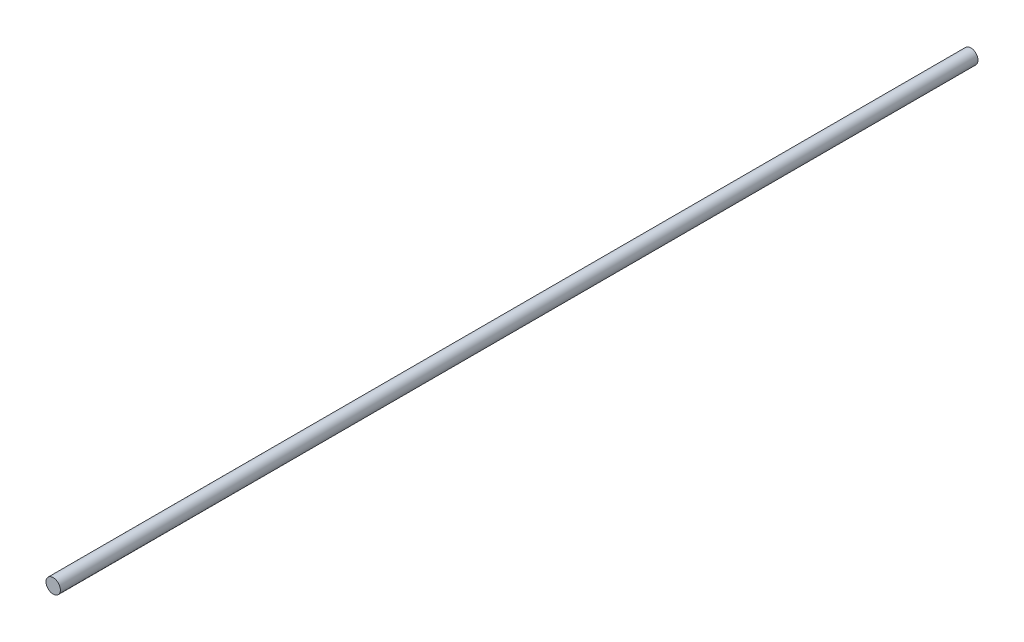
ISO-10303-21;
HEADER;
FILE_DESCRIPTION(('STEP AP214'),'2;1');
FILE_NAME('part.step','',(''),(''),'','','');
FILE_SCHEMA(('AUTOMOTIVE_DESIGN { 1 0 10303 214 1 1 1 1 }'));
ENDSEC;
DATA;
#1=APPLICATION_CONTEXT('core data for automotive mechanical design processes');
#2=APPLICATION_PROTOCOL_DEFINITION('international standard','automotive_design',2000,#1);
#3=PRODUCT_CONTEXT('',#1,'mechanical');
#4=PRODUCT('Part','Part','',(#3));
#5=PRODUCT_RELATED_PRODUCT_CATEGORY('part','',(#4));
#6=PRODUCT_DEFINITION_FORMATION('','',#4);
#7=PRODUCT_DEFINITION_CONTEXT('part definition',#1,'design');
#8=PRODUCT_DEFINITION('design','',#6,#7);
#9=PRODUCT_DEFINITION_SHAPE('','',#8);
#10=(LENGTH_UNIT() NAMED_UNIT(*) SI_UNIT(.MILLI.,.METRE.));
#11=(NAMED_UNIT(*) PLANE_ANGLE_UNIT() SI_UNIT($,.RADIAN.));
#12=(NAMED_UNIT(*) SI_UNIT($,.STERADIAN.) SOLID_ANGLE_UNIT());
#13=UNCERTAINTY_MEASURE_WITH_UNIT(LENGTH_MEASURE(1.E-05),#10,'distance_accuracy_value','');
#14=(GEOMETRIC_REPRESENTATION_CONTEXT(3) GLOBAL_UNCERTAINTY_ASSIGNED_CONTEXT((#13)) GLOBAL_UNIT_ASSIGNED_CONTEXT((#10,
#11,#12)) REPRESENTATION_CONTEXT('',''));
#15=CARTESIAN_POINT('',(0.,0.,0.));
#16=DIRECTION('',(0.,0.,1.));
#17=DIRECTION('',(1.,0.,0.));
#18=AXIS2_PLACEMENT_3D('',#15,#16,#17);
#19=CARTESIAN_POINT('',(0.,0.,638.));
#20=DIRECTION('',(0.,0.,-1.));
#21=DIRECTION('',(-1.,0.,0.));
#22=AXIS2_PLACEMENT_3D('',#19,#20,#21);
#23=CYLINDRICAL_SURFACE('',#22,5.);
#24=CARTESIAN_POINT('',(0.,0.,638.));
#25=DIRECTION('',(0.,0.,1.));
#26=DIRECTION('',(1.,0.,0.));
#27=AXIS2_PLACEMENT_3D('',#24,#25,#26);
#28=CIRCLE('',#27,5.);
#29=CARTESIAN_POINT('',(5.,0.,638.));
#30=VERTEX_POINT('',#29);
#31=EDGE_CURVE('E10',#30,#30,#28,.T.);
#32=ORIENTED_EDGE('',*,*,#31,.F.);
#33=EDGE_LOOP('',(#32));
#34=FACE_BOUND('',#33,.T.);
#35=CARTESIAN_POINT('',(0.,0.,0.));
#36=DIRECTION('',(0.,0.,1.));
#37=DIRECTION('',(1.,0.,0.));
#38=AXIS2_PLACEMENT_3D('',#35,#36,#37);
#39=CIRCLE('',#38,5.);
#40=CARTESIAN_POINT('',(5.,0.,0.));
#41=VERTEX_POINT('',#40);
#42=EDGE_CURVE('E35',#41,#41,#39,.T.);
#43=ORIENTED_EDGE('',*,*,#42,.T.);
#44=EDGE_LOOP('',(#43));
#45=FACE_BOUND('',#44,.T.);
#46=ADVANCED_FACE('F32',(#34,#45),#23,.T.);
#47=CARTESIAN_POINT('',(0.,0.,638.));
#48=DIRECTION('',(0.,0.,1.));
#49=DIRECTION('',(1.,0.,0.));
#50=AXIS2_PLACEMENT_3D('',#47,#48,#49);
#51=PLANE('',#50);
#52=ORIENTED_EDGE('',*,*,#31,.T.);
#53=EDGE_LOOP('',(#52));
#54=FACE_BOUND('',#53,.T.);
#55=ADVANCED_FACE('F47',(#54),#51,.T.);
#56=CARTESIAN_POINT('',(0.,0.,0.));
#57=DIRECTION('',(0.,0.,1.));
#58=DIRECTION('',(1.,0.,0.));
#59=AXIS2_PLACEMENT_3D('',#56,#57,#58);
#60=PLANE('',#59);
#61=ORIENTED_EDGE('',*,*,#42,.F.);
#62=EDGE_LOOP('',(#61));
#63=FACE_BOUND('',#62,.T.);
#64=ADVANCED_FACE('F45',(#63),#60,.F.);
#65=CLOSED_SHELL('',(#46,#55,#64));
#66=MANIFOLD_SOLID_BREP('B2',#65);
#67=ADVANCED_BREP_SHAPE_REPRESENTATION('',(#18,#66),#14);
#68=SHAPE_DEFINITION_REPRESENTATION(#9,#67);
ENDSEC;
END-ISO-10303-21;
